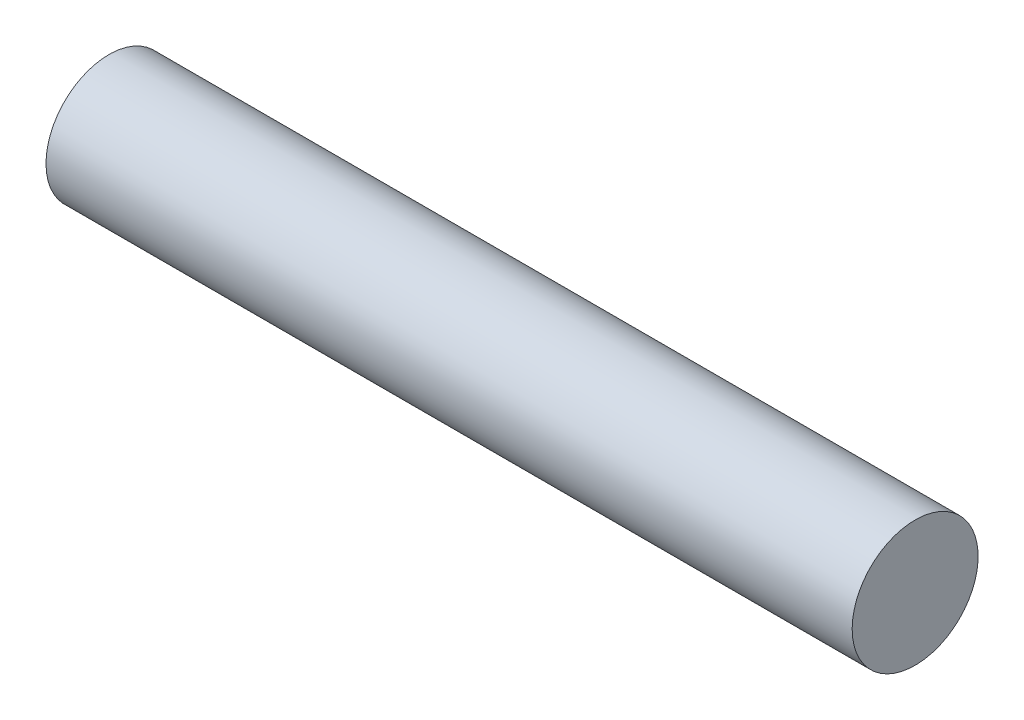
ISO-10303-21;
HEADER;
FILE_DESCRIPTION(('STEP AP214'),'2;1');
FILE_NAME('part.step','',(''),(''),'','','');
FILE_SCHEMA(('AUTOMOTIVE_DESIGN { 1 0 10303 214 1 1 1 1 }'));
ENDSEC;
DATA;
#1=APPLICATION_CONTEXT('core data for automotive mechanical design processes');
#2=APPLICATION_PROTOCOL_DEFINITION('international standard','automotive_design',2000,#1);
#3=PRODUCT_CONTEXT('',#1,'mechanical');
#4=PRODUCT('Part','Part','',(#3));
#5=PRODUCT_RELATED_PRODUCT_CATEGORY('part','',(#4));
#6=PRODUCT_DEFINITION_FORMATION('','',#4);
#7=PRODUCT_DEFINITION_CONTEXT('part definition',#1,'design');
#8=PRODUCT_DEFINITION('design','',#6,#7);
#9=PRODUCT_DEFINITION_SHAPE('','',#8);
#10=(LENGTH_UNIT() NAMED_UNIT(*) SI_UNIT(.MILLI.,.METRE.));
#11=(NAMED_UNIT(*) PLANE_ANGLE_UNIT() SI_UNIT($,.RADIAN.));
#12=(NAMED_UNIT(*) SI_UNIT($,.STERADIAN.) SOLID_ANGLE_UNIT());
#13=UNCERTAINTY_MEASURE_WITH_UNIT(LENGTH_MEASURE(1.E-05),#10,'distance_accuracy_value','');
#14=(GEOMETRIC_REPRESENTATION_CONTEXT(3) GLOBAL_UNCERTAINTY_ASSIGNED_CONTEXT((#13)) GLOBAL_UNIT_ASSIGNED_CONTEXT((#10,
#11,#12)) REPRESENTATION_CONTEXT('',''));
#15=CARTESIAN_POINT('',(0.,0.,0.));
#16=DIRECTION('',(0.,0.,1.));
#17=DIRECTION('',(1.,0.,0.));
#18=AXIS2_PLACEMENT_3D('',#15,#16,#17);
#19=CARTESIAN_POINT('',(0.,0.,0.));
#20=DIRECTION('',(1.,0.,0.));
#21=DIRECTION('',(0.,1.,0.));
#22=AXIS2_PLACEMENT_3D('',#19,#20,#21);
#23=PLANE('',#22);
#24=CARTESIAN_POINT('',(0.,0.,0.));
#25=DIRECTION('',(1.,0.,0.));
#26=DIRECTION('',(0.,0.,1.));
#27=AXIS2_PLACEMENT_3D('',#24,#25,#26);
#28=CIRCLE('',#27,1.25);
#29=CARTESIAN_POINT('',(0.,0.,1.25));
#30=VERTEX_POINT('',#29);
#31=EDGE_CURVE('E9',#30,#30,#28,.T.);
#32=ORIENTED_EDGE('',*,*,#31,.F.);
#33=EDGE_LOOP('',(#32));
#34=FACE_BOUND('',#33,.T.);
#35=ADVANCED_FACE('F14',(#34),#23,.F.);
#36=CARTESIAN_POINT('',(16.,0.,0.));
#37=DIRECTION('',(1.,0.,0.));
#38=DIRECTION('',(0.,1.,0.));
#39=AXIS2_PLACEMENT_3D('',#36,#37,#38);
#40=PLANE('',#39);
#41=CARTESIAN_POINT('',(16.,0.,0.));
#42=DIRECTION('',(1.,0.,0.));
#43=DIRECTION('',(0.,0.,1.));
#44=AXIS2_PLACEMENT_3D('',#41,#42,#43);
#45=CIRCLE('',#44,1.25);
#46=CARTESIAN_POINT('',(16.,0.,1.25));
#47=VERTEX_POINT('',#46);
#48=EDGE_CURVE('E17',#47,#47,#45,.T.);
#49=ORIENTED_EDGE('',*,*,#48,.T.);
#50=EDGE_LOOP('',(#49));
#51=FACE_BOUND('',#50,.T.);
#52=ADVANCED_FACE('F32',(#51),#40,.T.);
#53=CARTESIAN_POINT('',(0.,0.,0.));
#54=DIRECTION('',(1.,0.,0.));
#55=DIRECTION('',(0.,0.,1.));
#56=AXIS2_PLACEMENT_3D('',#53,#54,#55);
#57=CYLINDRICAL_SURFACE('',#56,1.25);
#58=ORIENTED_EDGE('',*,*,#48,.F.);
#59=EDGE_LOOP('',(#58));
#60=FACE_BOUND('',#59,.T.);
#61=ORIENTED_EDGE('',*,*,#31,.T.);
#62=EDGE_LOOP('',(#61));
#63=FACE_BOUND('',#62,.T.);
#64=ADVANCED_FACE('F34',(#60,#63),#57,.T.);
#65=CLOSED_SHELL('',(#35,#52,#64));
#66=MANIFOLD_SOLID_BREP('B1',#65);
#67=ADVANCED_BREP_SHAPE_REPRESENTATION('',(#18,#66),#14);
#68=SHAPE_DEFINITION_REPRESENTATION(#9,#67);
ENDSEC;
END-ISO-10303-21;
